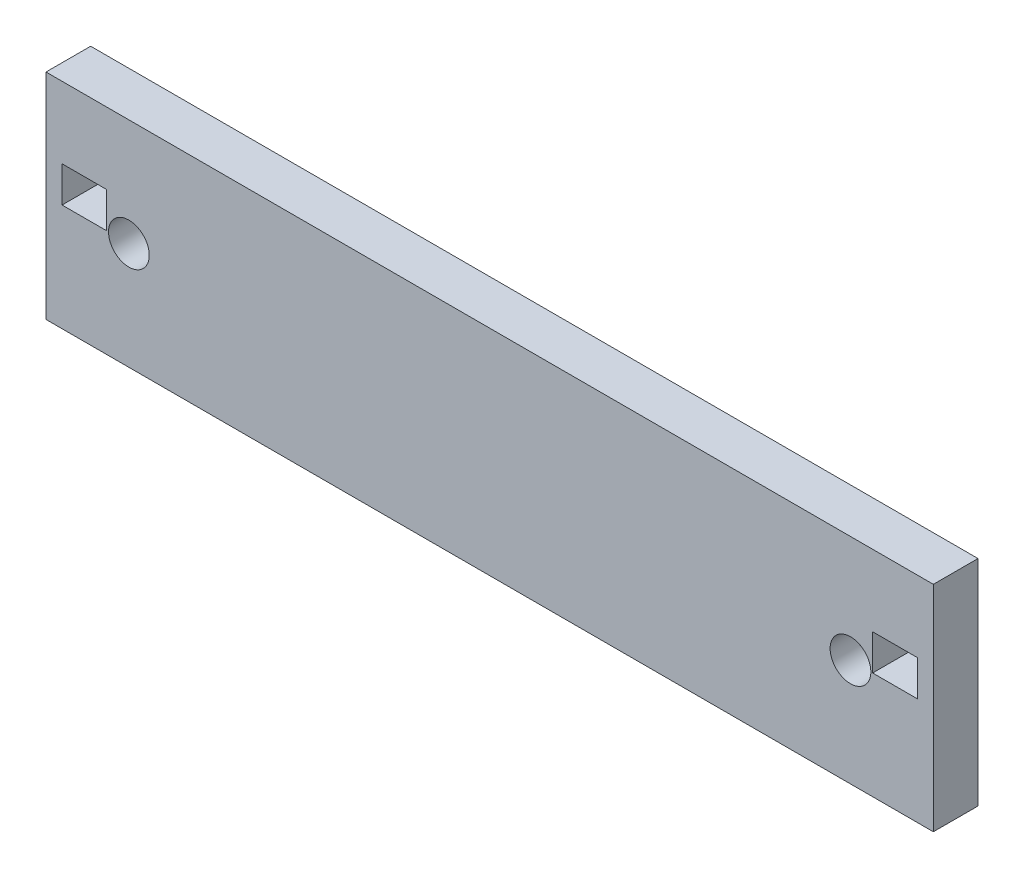
ISO-10303-21;
HEADER;
FILE_DESCRIPTION(('STEP AP214'),'2;1');
FILE_NAME('part.step','',(''),(''),'','','');
FILE_SCHEMA(('AUTOMOTIVE_DESIGN { 1 0 10303 214 1 1 1 1 }'));
ENDSEC;
DATA;
#1=APPLICATION_CONTEXT('core data for automotive mechanical design processes');
#2=APPLICATION_PROTOCOL_DEFINITION('international standard','automotive_design',2000,#1);
#3=PRODUCT_CONTEXT('',#1,'mechanical');
#4=PRODUCT('Part','Part','',(#3));
#5=PRODUCT_RELATED_PRODUCT_CATEGORY('part','',(#4));
#6=PRODUCT_DEFINITION_FORMATION('','',#4);
#7=PRODUCT_DEFINITION_CONTEXT('part definition',#1,'design');
#8=PRODUCT_DEFINITION('design','',#6,#7);
#9=PRODUCT_DEFINITION_SHAPE('','',#8);
#10=(LENGTH_UNIT() NAMED_UNIT(*) SI_UNIT(.MILLI.,.METRE.));
#11=(NAMED_UNIT(*) PLANE_ANGLE_UNIT() SI_UNIT($,.RADIAN.));
#12=(NAMED_UNIT(*) SI_UNIT($,.STERADIAN.) SOLID_ANGLE_UNIT());
#13=UNCERTAINTY_MEASURE_WITH_UNIT(LENGTH_MEASURE(1.E-05),#10,'distance_accuracy_value','');
#14=(GEOMETRIC_REPRESENTATION_CONTEXT(3) GLOBAL_UNCERTAINTY_ASSIGNED_CONTEXT((#13)) GLOBAL_UNIT_ASSIGNED_CONTEXT((#10,
#11,#12)) REPRESENTATION_CONTEXT('',''));
#15=CARTESIAN_POINT('',(0.,0.,0.));
#16=DIRECTION('',(0.,0.,1.));
#17=DIRECTION('',(1.,0.,0.));
#18=AXIS2_PLACEMENT_3D('',#15,#16,#17);
#19=CARTESIAN_POINT('',(13.5128,3.81,1.5875));
#20=DIRECTION('',(0.,0.,-1.));
#21=DIRECTION('',(-1.,0.,0.));
#22=AXIS2_PLACEMENT_3D('',#19,#20,#21);
#23=PLANE('',#22);
#24=CARTESIAN_POINT('',(-15.0876,0.,1.5875));
#25=DIRECTION('',(0.,0.,1.));
#26=DIRECTION('',(1.,0.,0.));
#27=AXIS2_PLACEMENT_3D('',#24,#25,#26);
#28=CIRCLE('',#27,0.723899999999998);
#29=CARTESIAN_POINT('',(-14.3637,0.,1.5875));
#30=VERTEX_POINT('',#29);
#31=EDGE_CURVE('E151',#30,#30,#28,.T.);
#32=ORIENTED_EDGE('',*,*,#31,.F.);
#33=EDGE_LOOP('',(#32));
#34=FACE_BOUND('',#33,.T.);
#35=DIRECTION('',(0.,-1.,0.));
#36=VECTOR('',#35,1.);
#37=CARTESIAN_POINT('',(-17.4625,0.,1.5875));
#38=LINE('',#37,#36);
#39=CARTESIAN_POINT('',(-17.4625,1.27,1.5875));
#40=VERTEX_POINT('',#39);
#41=CARTESIAN_POINT('',(-17.4625,0.,1.5875));
#42=VERTEX_POINT('',#41);
#43=EDGE_CURVE('E161',#40,#42,#38,.T.);
#44=ORIENTED_EDGE('',*,*,#43,.F.);
#45=DIRECTION('',(-1.,0.,0.));
#46=VECTOR('',#45,1.);
#47=CARTESIAN_POINT('',(-17.4625,1.27,1.5875));
#48=LINE('',#47,#46);
#49=CARTESIAN_POINT('',(-15.875,1.27,1.5875));
#50=VERTEX_POINT('',#49);
#51=EDGE_CURVE('E169',#50,#40,#48,.T.);
#52=ORIENTED_EDGE('',*,*,#51,.F.);
#53=DIRECTION('',(0.,1.,0.));
#54=VECTOR('',#53,1.);
#55=CARTESIAN_POINT('',(-15.875,0.,1.5875));
#56=LINE('',#55,#54);
#57=CARTESIAN_POINT('',(-15.875,0.,1.5875));
#58=VERTEX_POINT('',#57);
#59=EDGE_CURVE('E166',#58,#50,#56,.T.);
#60=ORIENTED_EDGE('',*,*,#59,.F.);
#61=DIRECTION('',(1.,0.,0.));
#62=VECTOR('',#61,1.);
#63=CARTESIAN_POINT('',(-17.4625,0.,1.5875));
#64=LINE('',#63,#62);
#65=EDGE_CURVE('E163',#42,#58,#64,.T.);
#66=ORIENTED_EDGE('',*,*,#65,.F.);
#67=EDGE_LOOP('',(#44,#52,#60,#66));
#68=FACE_BOUND('',#67,.T.);
#69=DIRECTION('',(0.,1.,0.));
#70=VECTOR('',#69,1.);
#71=CARTESIAN_POINT('',(13.5128,-3.81,1.5875));
#72=LINE('',#71,#70);
#73=CARTESIAN_POINT('',(13.5128,-3.81,1.5875));
#74=VERTEX_POINT('',#73);
#75=CARTESIAN_POINT('',(13.5128,3.81,1.5875));
#76=VERTEX_POINT('',#75);
#77=EDGE_CURVE('E192',#74,#76,#72,.T.);
#78=ORIENTED_EDGE('',*,*,#77,.T.);
#79=DIRECTION('',(-1.,0.,0.));
#80=VECTOR('',#79,1.);
#81=CARTESIAN_POINT('',(-18.034,3.81,1.5875));
#82=LINE('',#81,#80);
#83=CARTESIAN_POINT('',(-18.034,3.81,1.5875));
#84=VERTEX_POINT('',#83);
#85=EDGE_CURVE('E195',#76,#84,#82,.T.);
#86=ORIENTED_EDGE('',*,*,#85,.T.);
#87=DIRECTION('',(0.,-1.,0.));
#88=VECTOR('',#87,1.);
#89=CARTESIAN_POINT('',(-18.034,-3.81,1.5875));
#90=LINE('',#89,#88);
#91=CARTESIAN_POINT('',(-18.034,-3.81,1.5875));
#92=VERTEX_POINT('',#91);
#93=EDGE_CURVE('E198',#84,#92,#90,.T.);
#94=ORIENTED_EDGE('',*,*,#93,.T.);
#95=DIRECTION('',(1.,0.,0.));
#96=VECTOR('',#95,1.);
#97=CARTESIAN_POINT('',(-18.034,-3.81,1.5875));
#98=LINE('',#97,#96);
#99=EDGE_CURVE('E200',#92,#74,#98,.T.);
#100=ORIENTED_EDGE('',*,*,#99,.T.);
#101=EDGE_LOOP('',(#78,#86,#94,#100));
#102=FACE_BOUND('',#101,.T.);
#103=DIRECTION('',(1.,0.,0.));
#104=VECTOR('',#103,1.);
#105=CARTESIAN_POINT('',(12.9413,0.,1.5875));
#106=LINE('',#105,#104);
#107=CARTESIAN_POINT('',(11.3538,0.,1.5875));
#108=VERTEX_POINT('',#107);
#109=CARTESIAN_POINT('',(12.9413,0.,1.5875));
#110=VERTEX_POINT('',#109);
#111=EDGE_CURVE('E122',#108,#110,#106,.T.);
#112=ORIENTED_EDGE('',*,*,#111,.F.);
#113=DIRECTION('',(0.,-1.,0.));
#114=VECTOR('',#113,1.);
#115=CARTESIAN_POINT('',(11.3538,0.,1.5875));
#116=LINE('',#115,#114);
#117=CARTESIAN_POINT('',(11.3538,1.27,1.5875));
#118=VERTEX_POINT('',#117);
#119=EDGE_CURVE('E145',#118,#108,#116,.T.);
#120=ORIENTED_EDGE('',*,*,#119,.F.);
#121=DIRECTION('',(-1.,0.,0.));
#122=VECTOR('',#121,1.);
#123=CARTESIAN_POINT('',(12.9413,1.27,1.5875));
#124=LINE('',#123,#122);
#125=CARTESIAN_POINT('',(12.9413,1.27,1.5875));
#126=VERTEX_POINT('',#125);
#127=EDGE_CURVE('E143',#126,#118,#124,.T.);
#128=ORIENTED_EDGE('',*,*,#127,.F.);
#129=DIRECTION('',(0.,1.,0.));
#130=VECTOR('',#129,1.);
#131=CARTESIAN_POINT('',(12.9413,0.,1.5875));
#132=LINE('',#131,#130);
#133=EDGE_CURVE('E130',#110,#126,#132,.T.);
#134=ORIENTED_EDGE('',*,*,#133,.F.);
#135=EDGE_LOOP('',(#112,#120,#128,#134));
#136=FACE_BOUND('',#135,.T.);
#137=CARTESIAN_POINT('',(10.5664,0.,1.5875));
#138=DIRECTION('',(0.,0.,1.));
#139=DIRECTION('',(-1.,0.,0.));
#140=AXIS2_PLACEMENT_3D('',#137,#138,#139);
#141=CIRCLE('',#140,0.7239);
#142=CARTESIAN_POINT('',(9.8425,0.,1.5875));
#143=VERTEX_POINT('',#142);
#144=EDGE_CURVE('E310',#143,#143,#141,.T.);
#145=ORIENTED_EDGE('',*,*,#144,.F.);
#146=EDGE_LOOP('',(#145));
#147=FACE_BOUND('',#146,.T.);
#148=ADVANCED_FACE('F33',(#34,#68,#102,#136,#147),#23,.F.);
#149=CARTESIAN_POINT('',(13.5128,3.81,0.));
#150=DIRECTION('',(0.,0.,-1.));
#151=DIRECTION('',(-1.,0.,0.));
#152=AXIS2_PLACEMENT_3D('',#149,#150,#151);
#153=PLANE('',#152);
#154=CARTESIAN_POINT('',(-15.0876,0.,0.));
#155=DIRECTION('',(0.,0.,1.));
#156=DIRECTION('',(1.,0.,0.));
#157=AXIS2_PLACEMENT_3D('',#154,#155,#156);
#158=CIRCLE('',#157,0.723899999999998);
#159=CARTESIAN_POINT('',(-14.3637,0.,0.));
#160=VERTEX_POINT('',#159);
#161=EDGE_CURVE('E316',#160,#160,#158,.T.);
#162=ORIENTED_EDGE('',*,*,#161,.T.);
#163=EDGE_LOOP('',(#162));
#164=FACE_BOUND('',#163,.T.);
#165=DIRECTION('',(-1.,0.,0.));
#166=VECTOR('',#165,1.);
#167=CARTESIAN_POINT('',(-17.4625,1.27,0.));
#168=LINE('',#167,#166);
#169=CARTESIAN_POINT('',(-15.875,1.27,0.));
#170=VERTEX_POINT('',#169);
#171=CARTESIAN_POINT('',(-17.4625,1.27,0.));
#172=VERTEX_POINT('',#171);
#173=EDGE_CURVE('E164',#170,#172,#168,.T.);
#174=ORIENTED_EDGE('',*,*,#173,.T.);
#175=DIRECTION('',(0.,-1.,0.));
#176=VECTOR('',#175,1.);
#177=CARTESIAN_POINT('',(-17.4625,0.,0.));
#178=LINE('',#177,#176);
#179=CARTESIAN_POINT('',(-17.4625,0.,0.));
#180=VERTEX_POINT('',#179);
#181=EDGE_CURVE('E138',#172,#180,#178,.T.);
#182=ORIENTED_EDGE('',*,*,#181,.T.);
#183=DIRECTION('',(1.,0.,0.));
#184=VECTOR('',#183,1.);
#185=CARTESIAN_POINT('',(-17.4625,0.,0.));
#186=LINE('',#185,#184);
#187=CARTESIAN_POINT('',(-15.875,0.,0.));
#188=VERTEX_POINT('',#187);
#189=EDGE_CURVE('E174',#180,#188,#186,.T.);
#190=ORIENTED_EDGE('',*,*,#189,.T.);
#191=DIRECTION('',(0.,1.,0.));
#192=VECTOR('',#191,1.);
#193=CARTESIAN_POINT('',(-15.875,0.,0.));
#194=LINE('',#193,#192);
#195=EDGE_CURVE('E177',#188,#170,#194,.T.);
#196=ORIENTED_EDGE('',*,*,#195,.T.);
#197=EDGE_LOOP('',(#174,#182,#190,#196));
#198=FACE_BOUND('',#197,.T.);
#199=DIRECTION('',(0.,1.,0.));
#200=VECTOR('',#199,1.);
#201=CARTESIAN_POINT('',(13.5128,-3.81,0.));
#202=LINE('',#201,#200);
#203=CARTESIAN_POINT('',(13.5128,-3.81,0.));
#204=VERTEX_POINT('',#203);
#205=CARTESIAN_POINT('',(13.5128,3.81,0.));
#206=VERTEX_POINT('',#205);
#207=EDGE_CURVE('E191',#204,#206,#202,.T.);
#208=ORIENTED_EDGE('',*,*,#207,.F.);
#209=DIRECTION('',(1.,0.,0.));
#210=VECTOR('',#209,1.);
#211=CARTESIAN_POINT('',(-18.034,-3.81,0.));
#212=LINE('',#211,#210);
#213=CARTESIAN_POINT('',(-18.034,-3.81,0.));
#214=VERTEX_POINT('',#213);
#215=EDGE_CURVE('E196',#214,#204,#212,.T.);
#216=ORIENTED_EDGE('',*,*,#215,.F.);
#217=DIRECTION('',(0.,-1.,0.));
#218=VECTOR('',#217,1.);
#219=CARTESIAN_POINT('',(-18.034,-3.81,0.));
#220=LINE('',#219,#218);
#221=CARTESIAN_POINT('',(-18.034,3.81,0.));
#222=VERTEX_POINT('',#221);
#223=EDGE_CURVE('E207',#222,#214,#220,.T.);
#224=ORIENTED_EDGE('',*,*,#223,.F.);
#225=DIRECTION('',(-1.,0.,0.));
#226=VECTOR('',#225,1.);
#227=CARTESIAN_POINT('',(-18.034,3.81,0.));
#228=LINE('',#227,#226);
#229=EDGE_CURVE('E205',#206,#222,#228,.T.);
#230=ORIENTED_EDGE('',*,*,#229,.F.);
#231=EDGE_LOOP('',(#208,#216,#224,#230));
#232=FACE_BOUND('',#231,.T.);
#233=DIRECTION('',(0.,-1.,0.));
#234=VECTOR('',#233,1.);
#235=CARTESIAN_POINT('',(11.3538,0.,0.));
#236=LINE('',#235,#234);
#237=CARTESIAN_POINT('',(11.3538,1.27,0.));
#238=VERTEX_POINT('',#237);
#239=CARTESIAN_POINT('',(11.3538,0.,0.));
#240=VERTEX_POINT('',#239);
#241=EDGE_CURVE('E131',#238,#240,#236,.T.);
#242=ORIENTED_EDGE('',*,*,#241,.T.);
#243=DIRECTION('',(1.,0.,0.));
#244=VECTOR('',#243,1.);
#245=CARTESIAN_POINT('',(12.9413,0.,0.));
#246=LINE('',#245,#244);
#247=CARTESIAN_POINT('',(12.9413,0.,0.));
#248=VERTEX_POINT('',#247);
#249=EDGE_CURVE('E56',#240,#248,#246,.T.);
#250=ORIENTED_EDGE('',*,*,#249,.T.);
#251=DIRECTION('',(0.,1.,0.));
#252=VECTOR('',#251,1.);
#253=CARTESIAN_POINT('',(12.9413,0.,0.));
#254=LINE('',#253,#252);
#255=CARTESIAN_POINT('',(12.9413,1.27,0.));
#256=VERTEX_POINT('',#255);
#257=EDGE_CURVE('E137',#248,#256,#254,.T.);
#258=ORIENTED_EDGE('',*,*,#257,.T.);
#259=DIRECTION('',(-1.,0.,0.));
#260=VECTOR('',#259,1.);
#261=CARTESIAN_POINT('',(12.9413,1.27,0.));
#262=LINE('',#261,#260);
#263=EDGE_CURVE('E153',#256,#238,#262,.T.);
#264=ORIENTED_EDGE('',*,*,#263,.T.);
#265=EDGE_LOOP('',(#242,#250,#258,#264));
#266=FACE_BOUND('',#265,.T.);
#267=CARTESIAN_POINT('',(10.5664,0.,0.));
#268=DIRECTION('',(0.,0.,1.));
#269=DIRECTION('',(-1.,0.,0.));
#270=AXIS2_PLACEMENT_3D('',#267,#268,#269);
#271=CIRCLE('',#270,0.7239);
#272=CARTESIAN_POINT('',(9.8425,0.,0.));
#273=VERTEX_POINT('',#272);
#274=EDGE_CURVE('E313',#273,#273,#271,.T.);
#275=ORIENTED_EDGE('',*,*,#274,.T.);
#276=EDGE_LOOP('',(#275));
#277=FACE_BOUND('',#276,.T.);
#278=ADVANCED_FACE('F225',(#164,#198,#232,#266,#277),#153,.T.);
#279=CARTESIAN_POINT('',(13.5128,-3.81,1.5875));
#280=DIRECTION('',(-1.,0.,0.));
#281=DIRECTION('',(0.,0.,1.));
#282=AXIS2_PLACEMENT_3D('',#279,#280,#281);
#283=PLANE('',#282);
#284=ORIENTED_EDGE('',*,*,#207,.T.);
#285=DIRECTION('',(0.,0.,-1.));
#286=VECTOR('',#285,1.);
#287=CARTESIAN_POINT('',(13.5128,3.81,1.5875));
#288=LINE('',#287,#286);
#289=EDGE_CURVE('E11',#76,#206,#288,.T.);
#290=ORIENTED_EDGE('',*,*,#289,.F.);
#291=ORIENTED_EDGE('',*,*,#77,.F.);
#292=DIRECTION('',(0.,0.,-1.));
#293=VECTOR('',#292,1.);
#294=CARTESIAN_POINT('',(13.5128,-3.81,1.5875));
#295=LINE('',#294,#293);
#296=EDGE_CURVE('E202',#74,#204,#295,.T.);
#297=ORIENTED_EDGE('',*,*,#296,.T.);
#298=EDGE_LOOP('',(#284,#290,#291,#297));
#299=FACE_BOUND('',#298,.T.);
#300=ADVANCED_FACE('F35',(#299),#283,.F.);
#301=CARTESIAN_POINT('',(-18.034,3.81,1.5875));
#302=DIRECTION('',(0.,-1.,0.));
#303=DIRECTION('',(0.,0.,-1.));
#304=AXIS2_PLACEMENT_3D('',#301,#302,#303);
#305=PLANE('',#304);
#306=ORIENTED_EDGE('',*,*,#229,.T.);
#307=DIRECTION('',(0.,0.,-1.));
#308=VECTOR('',#307,1.);
#309=CARTESIAN_POINT('',(-18.034,3.81,1.5875));
#310=LINE('',#309,#308);
#311=EDGE_CURVE('E41',#84,#222,#310,.T.);
#312=ORIENTED_EDGE('',*,*,#311,.F.);
#313=ORIENTED_EDGE('',*,*,#85,.F.);
#314=ORIENTED_EDGE('',*,*,#289,.T.);
#315=EDGE_LOOP('',(#306,#312,#313,#314));
#316=FACE_BOUND('',#315,.T.);
#317=ADVANCED_FACE('F235',(#316),#305,.F.);
#318=CARTESIAN_POINT('',(-18.034,-3.81,1.5875));
#319=DIRECTION('',(1.,0.,0.));
#320=DIRECTION('',(0.,0.,-1.));
#321=AXIS2_PLACEMENT_3D('',#318,#319,#320);
#322=PLANE('',#321);
#323=ORIENTED_EDGE('',*,*,#223,.T.);
#324=DIRECTION('',(0.,0.,-1.));
#325=VECTOR('',#324,1.);
#326=CARTESIAN_POINT('',(-18.034,-3.81,1.5875));
#327=LINE('',#326,#325);
#328=EDGE_CURVE('E212',#92,#214,#327,.T.);
#329=ORIENTED_EDGE('',*,*,#328,.F.);
#330=ORIENTED_EDGE('',*,*,#93,.F.);
#331=ORIENTED_EDGE('',*,*,#311,.T.);
#332=EDGE_LOOP('',(#323,#329,#330,#331));
#333=FACE_BOUND('',#332,.T.);
#334=ADVANCED_FACE('F219',(#333),#322,.F.);
#335=CARTESIAN_POINT('',(-18.034,-3.81,1.5875));
#336=DIRECTION('',(0.,1.,0.));
#337=DIRECTION('',(0.,0.,1.));
#338=AXIS2_PLACEMENT_3D('',#335,#336,#337);
#339=PLANE('',#338);
#340=ORIENTED_EDGE('',*,*,#215,.T.);
#341=ORIENTED_EDGE('',*,*,#296,.F.);
#342=ORIENTED_EDGE('',*,*,#99,.F.);
#343=ORIENTED_EDGE('',*,*,#328,.T.);
#344=EDGE_LOOP('',(#340,#341,#342,#343));
#345=FACE_BOUND('',#344,.T.);
#346=ADVANCED_FACE('F229',(#345),#339,.F.);
#347=CARTESIAN_POINT('',(-17.4625,0.,1.5875));
#348=DIRECTION('',(1.,0.,0.));
#349=DIRECTION('',(0.,0.,-1.));
#350=AXIS2_PLACEMENT_3D('',#347,#348,#349);
#351=PLANE('',#350);
#352=ORIENTED_EDGE('',*,*,#181,.F.);
#353=DIRECTION('',(0.,0.,-1.));
#354=VECTOR('',#353,1.);
#355=CARTESIAN_POINT('',(-17.4625,1.27,1.5875));
#356=LINE('',#355,#354);
#357=EDGE_CURVE('E171',#40,#172,#356,.T.);
#358=ORIENTED_EDGE('',*,*,#357,.F.);
#359=ORIENTED_EDGE('',*,*,#43,.T.);
#360=DIRECTION('',(0.,0.,-1.));
#361=VECTOR('',#360,1.);
#362=CARTESIAN_POINT('',(-17.4625,0.,1.5875));
#363=LINE('',#362,#361);
#364=EDGE_CURVE('E188',#42,#180,#363,.T.);
#365=ORIENTED_EDGE('',*,*,#364,.T.);
#366=EDGE_LOOP('',(#352,#358,#359,#365));
#367=FACE_BOUND('',#366,.T.);
#368=ADVANCED_FACE('F253',(#367),#351,.T.);
#369=CARTESIAN_POINT('',(-17.4625,0.,1.5875));
#370=DIRECTION('',(0.,1.,0.));
#371=DIRECTION('',(0.,0.,1.));
#372=AXIS2_PLACEMENT_3D('',#369,#370,#371);
#373=PLANE('',#372);
#374=ORIENTED_EDGE('',*,*,#189,.F.);
#375=ORIENTED_EDGE('',*,*,#364,.F.);
#376=ORIENTED_EDGE('',*,*,#65,.T.);
#377=DIRECTION('',(0.,0.,-1.));
#378=VECTOR('',#377,1.);
#379=CARTESIAN_POINT('',(-15.875,0.,1.5875));
#380=LINE('',#379,#378);
#381=EDGE_CURVE('E186',#58,#188,#380,.T.);
#382=ORIENTED_EDGE('',*,*,#381,.T.);
#383=EDGE_LOOP('',(#374,#375,#376,#382));
#384=FACE_BOUND('',#383,.T.);
#385=ADVANCED_FACE('F260',(#384),#373,.T.);
#386=CARTESIAN_POINT('',(-15.875,0.,1.5875));
#387=DIRECTION('',(-1.,0.,0.));
#388=DIRECTION('',(0.,0.,1.));
#389=AXIS2_PLACEMENT_3D('',#386,#387,#388);
#390=PLANE('',#389);
#391=ORIENTED_EDGE('',*,*,#195,.F.);
#392=ORIENTED_EDGE('',*,*,#381,.F.);
#393=ORIENTED_EDGE('',*,*,#59,.T.);
#394=DIRECTION('',(0.,0.,-1.));
#395=VECTOR('',#394,1.);
#396=CARTESIAN_POINT('',(-15.875,1.27,1.5875));
#397=LINE('',#396,#395);
#398=EDGE_CURVE('E184',#50,#170,#397,.T.);
#399=ORIENTED_EDGE('',*,*,#398,.T.);
#400=EDGE_LOOP('',(#391,#392,#393,#399));
#401=FACE_BOUND('',#400,.T.);
#402=ADVANCED_FACE('F265',(#401),#390,.T.);
#403=CARTESIAN_POINT('',(-17.4625,1.27,1.5875));
#404=DIRECTION('',(0.,-1.,0.));
#405=DIRECTION('',(0.,0.,-1.));
#406=AXIS2_PLACEMENT_3D('',#403,#404,#405);
#407=PLANE('',#406);
#408=ORIENTED_EDGE('',*,*,#173,.F.);
#409=ORIENTED_EDGE('',*,*,#398,.F.);
#410=ORIENTED_EDGE('',*,*,#51,.T.);
#411=ORIENTED_EDGE('',*,*,#357,.T.);
#412=EDGE_LOOP('',(#408,#409,#410,#411));
#413=FACE_BOUND('',#412,.T.);
#414=ADVANCED_FACE('F273',(#413),#407,.T.);
#415=CARTESIAN_POINT('',(12.9413,0.,1.5875));
#416=DIRECTION('',(0.,1.,0.));
#417=DIRECTION('',(-1.,0.,0.));
#418=AXIS2_PLACEMENT_3D('',#415,#416,#417);
#419=PLANE('',#418);
#420=ORIENTED_EDGE('',*,*,#249,.F.);
#421=DIRECTION('',(0.,0.,-1.));
#422=VECTOR('',#421,1.);
#423=CARTESIAN_POINT('',(11.3538,0.,1.5875));
#424=LINE('',#423,#422);
#425=EDGE_CURVE('E126',#108,#240,#424,.T.);
#426=ORIENTED_EDGE('',*,*,#425,.F.);
#427=ORIENTED_EDGE('',*,*,#111,.T.);
#428=DIRECTION('',(0.,0.,-1.));
#429=VECTOR('',#428,1.);
#430=CARTESIAN_POINT('',(12.9413,0.,1.5875));
#431=LINE('',#430,#429);
#432=EDGE_CURVE('E125',#110,#248,#431,.T.);
#433=ORIENTED_EDGE('',*,*,#432,.T.);
#434=EDGE_LOOP('',(#420,#426,#427,#433));
#435=FACE_BOUND('',#434,.T.);
#436=ADVANCED_FACE('F124',(#435),#419,.T.);
#437=CARTESIAN_POINT('',(12.9413,0.,1.5875));
#438=DIRECTION('',(-1.,0.,0.));
#439=DIRECTION('',(0.,-1.,0.));
#440=AXIS2_PLACEMENT_3D('',#437,#438,#439);
#441=PLANE('',#440);
#442=ORIENTED_EDGE('',*,*,#257,.F.);
#443=ORIENTED_EDGE('',*,*,#432,.F.);
#444=ORIENTED_EDGE('',*,*,#133,.T.);
#445=DIRECTION('',(0.,0.,-1.));
#446=VECTOR('',#445,1.);
#447=CARTESIAN_POINT('',(12.9413,1.27,1.5875));
#448=LINE('',#447,#446);
#449=EDGE_CURVE('E139',#126,#256,#448,.T.);
#450=ORIENTED_EDGE('',*,*,#449,.T.);
#451=EDGE_LOOP('',(#442,#443,#444,#450));
#452=FACE_BOUND('',#451,.T.);
#453=ADVANCED_FACE('F134',(#452),#441,.T.);
#454=CARTESIAN_POINT('',(12.9413,1.27,1.5875));
#455=DIRECTION('',(0.,-1.,0.));
#456=DIRECTION('',(1.,0.,0.));
#457=AXIS2_PLACEMENT_3D('',#454,#455,#456);
#458=PLANE('',#457);
#459=ORIENTED_EDGE('',*,*,#263,.F.);
#460=ORIENTED_EDGE('',*,*,#449,.F.);
#461=ORIENTED_EDGE('',*,*,#127,.T.);
#462=DIRECTION('',(0.,0.,-1.));
#463=VECTOR('',#462,1.);
#464=CARTESIAN_POINT('',(11.3538,1.27,1.5875));
#465=LINE('',#464,#463);
#466=EDGE_CURVE('E48',#118,#238,#465,.T.);
#467=ORIENTED_EDGE('',*,*,#466,.T.);
#468=EDGE_LOOP('',(#459,#460,#461,#467));
#469=FACE_BOUND('',#468,.T.);
#470=ADVANCED_FACE('F291',(#469),#458,.T.);
#471=CARTESIAN_POINT('',(11.3538,0.,1.5875));
#472=DIRECTION('',(1.,0.,0.));
#473=DIRECTION('',(0.,0.,-1.));
#474=AXIS2_PLACEMENT_3D('',#471,#472,#473);
#475=PLANE('',#474);
#476=ORIENTED_EDGE('',*,*,#241,.F.);
#477=ORIENTED_EDGE('',*,*,#466,.F.);
#478=ORIENTED_EDGE('',*,*,#119,.T.);
#479=ORIENTED_EDGE('',*,*,#425,.T.);
#480=EDGE_LOOP('',(#476,#477,#478,#479));
#481=FACE_BOUND('',#480,.T.);
#482=ADVANCED_FACE('F294',(#481),#475,.T.);
#483=CARTESIAN_POINT('',(-15.0876,0.,1.5875));
#484=DIRECTION('',(0.,0.,-1.));
#485=DIRECTION('',(-1.,0.,0.));
#486=AXIS2_PLACEMENT_3D('',#483,#484,#485);
#487=CYLINDRICAL_SURFACE('',#486,0.723899999999998);
#488=ORIENTED_EDGE('',*,*,#31,.T.);
#489=EDGE_LOOP('',(#488));
#490=FACE_BOUND('',#489,.T.);
#491=ORIENTED_EDGE('',*,*,#161,.F.);
#492=EDGE_LOOP('',(#491));
#493=FACE_BOUND('',#492,.T.);
#494=ADVANCED_FACE('F298',(#490,#493),#487,.F.);
#495=CARTESIAN_POINT('',(10.5664,0.,1.5875));
#496=DIRECTION('',(0.,0.,-1.));
#497=DIRECTION('',(-1.,0.,0.));
#498=AXIS2_PLACEMENT_3D('',#495,#496,#497);
#499=CYLINDRICAL_SURFACE('',#498,0.7239);
#500=ORIENTED_EDGE('',*,*,#144,.T.);
#501=EDGE_LOOP('',(#500));
#502=FACE_BOUND('',#501,.T.);
#503=ORIENTED_EDGE('',*,*,#274,.F.);
#504=EDGE_LOOP('',(#503));
#505=FACE_BOUND('',#504,.T.);
#506=ADVANCED_FACE('F301',(#502,#505),#499,.F.);
#507=CLOSED_SHELL('',(#148,#278,#300,#317,#334,#346,#368,#385,#402,#414,#436,#453,#470,#482,
#494,#506));
#508=MANIFOLD_SOLID_BREP('B2',#507);
#509=ADVANCED_BREP_SHAPE_REPRESENTATION('',(#18,#508),#14);
#510=SHAPE_DEFINITION_REPRESENTATION(#9,#509);
ENDSEC;
END-ISO-10303-21;
